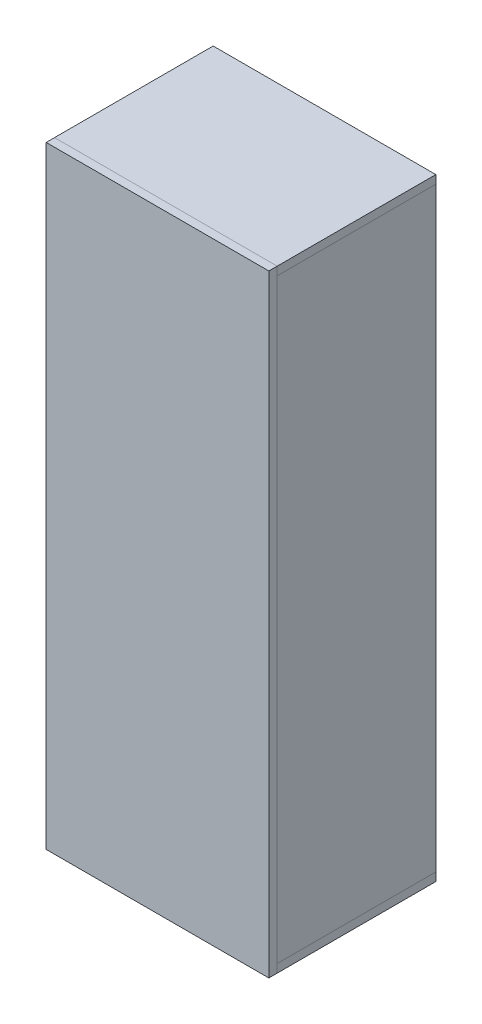
ISO-10303-21;
HEADER;
FILE_DESCRIPTION(('STEP AP214'),'2;1');
FILE_NAME('part.step','',(''),(''),'','','');
FILE_SCHEMA(('AUTOMOTIVE_DESIGN { 1 0 10303 214 1 1 1 1 }'));
ENDSEC;
DATA;
#1=APPLICATION_CONTEXT('core data for automotive mechanical design processes');
#2=APPLICATION_PROTOCOL_DEFINITION('international standard','automotive_design',2000,#1);
#3=PRODUCT_CONTEXT('',#1,'mechanical');
#4=PRODUCT('Part','Part','',(#3));
#5=PRODUCT_RELATED_PRODUCT_CATEGORY('part','',(#4));
#6=PRODUCT_DEFINITION_FORMATION('','',#4);
#7=PRODUCT_DEFINITION_CONTEXT('part definition',#1,'design');
#8=PRODUCT_DEFINITION('design','',#6,#7);
#9=PRODUCT_DEFINITION_SHAPE('','',#8);
#10=(LENGTH_UNIT() NAMED_UNIT(*) SI_UNIT(.MILLI.,.METRE.));
#11=(NAMED_UNIT(*) PLANE_ANGLE_UNIT() SI_UNIT($,.RADIAN.));
#12=(NAMED_UNIT(*) SI_UNIT($,.STERADIAN.) SOLID_ANGLE_UNIT());
#13=UNCERTAINTY_MEASURE_WITH_UNIT(LENGTH_MEASURE(1.E-05),#10,'distance_accuracy_value','');
#14=(GEOMETRIC_REPRESENTATION_CONTEXT(3) GLOBAL_UNCERTAINTY_ASSIGNED_CONTEXT((#13)) GLOBAL_UNIT_ASSIGNED_CONTEXT((#10,
#11,#12)) REPRESENTATION_CONTEXT('',''));
#15=CARTESIAN_POINT('',(0.,0.,0.));
#16=DIRECTION('',(0.,0.,1.));
#17=DIRECTION('',(1.,0.,0.));
#18=AXIS2_PLACEMENT_3D('',#15,#16,#17);
#19=CARTESIAN_POINT('',(0.,-7812.73256806932,0.));
#20=DIRECTION('',(0.,-1.,0.));
#21=DIRECTION('',(0.,0.,-1.));
#22=AXIS2_PLACEMENT_3D('',#19,#20,#21);
#23=PLANE('',#22);
#24=DIRECTION('',(0.,0.,-1.));
#25=VECTOR('',#24,1.);
#26=CARTESIAN_POINT('',(-788.349422114043,-7812.73256806932,-609.224669701424));
#27=LINE('',#26,#25);
#28=CARTESIAN_POINT('',(-788.349422114043,-7812.73256806932,-324.224669701424));
#29=VERTEX_POINT('',#28);
#30=CARTESIAN_POINT('',(-788.349422114043,-7812.73256806932,-609.224669701424));
#31=VERTEX_POINT('',#30);
#32=EDGE_CURVE('E100',#29,#31,#27,.T.);
#33=ORIENTED_EDGE('',*,*,#32,.T.);
#34=DIRECTION('',(-1.,0.,0.));
#35=VECTOR('',#34,1.);
#36=CARTESIAN_POINT('',(1.69093813868044E-13,-7812.73256806932,-609.224669701424));
#37=LINE('',#36,#35);
#38=CARTESIAN_POINT('',(-388.349422114043,-7812.73256806932,-609.224669701424));
#39=VERTEX_POINT('',#38);
#40=EDGE_CURVE('E13',#39,#31,#37,.T.);
#41=ORIENTED_EDGE('',*,*,#40,.F.);
#42=DIRECTION('',(0.,0.,1.));
#43=VECTOR('',#42,1.);
#44=CARTESIAN_POINT('',(-388.349422114043,-7812.73256806932,-609.224669701424));
#45=LINE('',#44,#43);
#46=CARTESIAN_POINT('',(-388.349422114043,-7812.73256806932,-324.224669701424));
#47=VERTEX_POINT('',#46);
#48=EDGE_CURVE('E61',#39,#47,#45,.T.);
#49=ORIENTED_EDGE('',*,*,#48,.T.);
#50=DIRECTION('',(1.,0.,0.));
#51=VECTOR('',#50,1.);
#52=CARTESIAN_POINT('',(0.,-7812.73256806932,-324.224669701424));
#53=LINE('',#52,#51);
#54=EDGE_CURVE('E97',#29,#47,#53,.T.);
#55=ORIENTED_EDGE('',*,*,#54,.F.);
#56=EDGE_LOOP('',(#33,#41,#49,#55));
#57=FACE_BOUND('',#56,.T.);
#58=ADVANCED_FACE('F57',(#57),#23,.T.);
#59=CARTESIAN_POINT('',(0.,0.,-324.224669701425));
#60=DIRECTION('',(0.,0.,-1.));
#61=DIRECTION('',(-1.,0.,0.));
#62=AXIS2_PLACEMENT_3D('',#59,#60,#61);
#63=PLANE('',#62);
#64=ORIENTED_EDGE('',*,*,#54,.T.);
#65=DIRECTION('',(0.,-1.,0.));
#66=VECTOR('',#65,1.);
#67=CARTESIAN_POINT('',(-388.349422114043,-7797.73256806932,-324.224669701424));
#68=LINE('',#67,#66);
#69=CARTESIAN_POINT('',(-388.349422114043,-7797.73256806932,-324.224669701424));
#70=VERTEX_POINT('',#69);
#71=EDGE_CURVE('E105',#70,#47,#68,.T.);
#72=ORIENTED_EDGE('',*,*,#71,.F.);
#73=DIRECTION('',(1.,0.,0.));
#74=VECTOR('',#73,1.);
#75=CARTESIAN_POINT('',(0.,-7797.73256806932,-324.224669701424));
#76=LINE('',#75,#74);
#77=CARTESIAN_POINT('',(-788.349422114043,-7797.73256806932,-324.224669701424));
#78=VERTEX_POINT('',#77);
#79=EDGE_CURVE('E109',#78,#70,#76,.T.);
#80=ORIENTED_EDGE('',*,*,#79,.F.);
#81=DIRECTION('',(0.,1.,0.));
#82=VECTOR('',#81,1.);
#83=CARTESIAN_POINT('',(-788.349422114043,-7797.73256806932,-324.224669701424));
#84=LINE('',#83,#82);
#85=EDGE_CURVE('E108',#29,#78,#84,.T.);
#86=ORIENTED_EDGE('',*,*,#85,.F.);
#87=EDGE_LOOP('',(#64,#72,#80,#86));
#88=FACE_BOUND('',#87,.T.);
#89=ADVANCED_FACE('F59',(#88),#63,.F.);
#90=CARTESIAN_POINT('',(-388.349422114043,-7797.73256806932,-609.224669701424));
#91=DIRECTION('',(-1.,0.,0.));
#92=DIRECTION('',(0.,0.,1.));
#93=AXIS2_PLACEMENT_3D('',#90,#91,#92);
#94=PLANE('',#93);
#95=ORIENTED_EDGE('',*,*,#48,.F.);
#96=DIRECTION('',(0.,-1.,0.));
#97=VECTOR('',#96,1.);
#98=CARTESIAN_POINT('',(-388.349422114043,-7797.73256806932,-609.224669701424));
#99=LINE('',#98,#97);
#100=CARTESIAN_POINT('',(-388.349422114043,-7797.73256806932,-609.224669701424));
#101=VERTEX_POINT('',#100);
#102=EDGE_CURVE('E119',#101,#39,#99,.T.);
#103=ORIENTED_EDGE('',*,*,#102,.F.);
#104=DIRECTION('',(0.,0.,-1.));
#105=VECTOR('',#104,1.);
#106=CARTESIAN_POINT('',(-388.349422114043,-7797.73256806932,-609.224669701424));
#107=LINE('',#106,#105);
#108=EDGE_CURVE('E66',#70,#101,#107,.T.);
#109=ORIENTED_EDGE('',*,*,#108,.F.);
#110=ORIENTED_EDGE('',*,*,#71,.T.);
#111=EDGE_LOOP('',(#95,#103,#109,#110));
#112=FACE_BOUND('',#111,.T.);
#113=ADVANCED_FACE('F122',(#112),#94,.F.);
#114=CARTESIAN_POINT('',(-388.349422114043,-7797.73256806932,-609.224669701424));
#115=DIRECTION('',(0.,0.,1.));
#116=DIRECTION('',(1.,0.,0.));
#117=AXIS2_PLACEMENT_3D('',#114,#115,#116);
#118=PLANE('',#117);
#119=ORIENTED_EDGE('',*,*,#40,.T.);
#120=DIRECTION('',(0.,-1.,0.));
#121=VECTOR('',#120,1.);
#122=CARTESIAN_POINT('',(-788.349422114043,-7797.73256806932,-609.224669701424));
#123=LINE('',#122,#121);
#124=CARTESIAN_POINT('',(-788.349422114043,-7797.73256806932,-609.224669701424));
#125=VERTEX_POINT('',#124);
#126=EDGE_CURVE('E115',#125,#31,#123,.T.);
#127=ORIENTED_EDGE('',*,*,#126,.F.);
#128=DIRECTION('',(-1.,0.,0.));
#129=VECTOR('',#128,1.);
#130=CARTESIAN_POINT('',(-388.349422114043,-7797.73256806932,-609.224669701424));
#131=LINE('',#130,#129);
#132=EDGE_CURVE('E77',#101,#125,#131,.T.);
#133=ORIENTED_EDGE('',*,*,#132,.F.);
#134=ORIENTED_EDGE('',*,*,#102,.T.);
#135=EDGE_LOOP('',(#119,#127,#133,#134));
#136=FACE_BOUND('',#135,.T.);
#137=ADVANCED_FACE('F135',(#136),#118,.F.);
#138=CARTESIAN_POINT('',(-788.349422114043,-7797.73256806932,-609.224669701424));
#139=DIRECTION('',(1.,0.,0.));
#140=DIRECTION('',(0.,0.,-1.));
#141=AXIS2_PLACEMENT_3D('',#138,#139,#140);
#142=PLANE('',#141);
#143=ORIENTED_EDGE('',*,*,#32,.F.);
#144=ORIENTED_EDGE('',*,*,#85,.T.);
#145=DIRECTION('',(0.,0.,1.));
#146=VECTOR('',#145,1.);
#147=CARTESIAN_POINT('',(-788.349422114043,-7797.73256806932,-609.224669701424));
#148=LINE('',#147,#146);
#149=EDGE_CURVE('E125',#125,#78,#148,.T.);
#150=ORIENTED_EDGE('',*,*,#149,.F.);
#151=ORIENTED_EDGE('',*,*,#126,.T.);
#152=EDGE_LOOP('',(#143,#144,#150,#151));
#153=FACE_BOUND('',#152,.T.);
#154=ADVANCED_FACE('F114',(#153),#142,.F.);
#155=CARTESIAN_POINT('',(0.,-7797.73256806932,-1.47021566313835E-13));
#156=DIRECTION('',(0.,-1.,0.));
#157=DIRECTION('',(0.,0.,-1.));
#158=AXIS2_PLACEMENT_3D('',#155,#156,#157);
#159=PLANE('',#158);
#160=ORIENTED_EDGE('',*,*,#149,.T.);
#161=ORIENTED_EDGE('',*,*,#79,.T.);
#162=ORIENTED_EDGE('',*,*,#108,.T.);
#163=ORIENTED_EDGE('',*,*,#132,.T.);
#164=EDGE_LOOP('',(#160,#161,#162,#163));
#165=FACE_BOUND('',#164,.T.);
#166=ADVANCED_FACE('F129',(#165),#159,.F.);
#167=CLOSED_SHELL('',(#58,#89,#113,#137,#154,#166));
#168=MANIFOLD_SOLID_BREP('B2',#167);
#169=CARTESIAN_POINT('',(0.,-7812.73256806932,0.));
#170=DIRECTION('',(0.,-1.,0.));
#171=DIRECTION('',(0.,0.,-1.));
#172=AXIS2_PLACEMENT_3D('',#169,#170,#171);
#173=PLANE('',#172);
#174=DIRECTION('',(0.,0.,1.));
#175=VECTOR('',#174,1.);
#176=CARTESIAN_POINT('',(-388.349422114043,-7812.73256806932,-609.224669701424));
#177=LINE('',#176,#175);
#178=CARTESIAN_POINT('',(-388.349422114043,-7812.73256806932,-609.224669701424));
#179=VERTEX_POINT('',#178);
#180=CARTESIAN_POINT('',(-388.349422114043,-7812.73256806932,-324.224669701424));
#181=VERTEX_POINT('',#180);
#182=EDGE_CURVE('E270',#179,#181,#177,.T.);
#183=ORIENTED_EDGE('',*,*,#182,.F.);
#184=DIRECTION('',(1.,0.,0.));
#185=VECTOR('',#184,1.);
#186=CARTESIAN_POINT('',(-388.349422114043,-7812.73256806932,-609.224669701424));
#187=LINE('',#186,#185);
#188=CARTESIAN_POINT('',(-403.349422114043,-7812.73256806932,-609.224669701424));
#189=VERTEX_POINT('',#188);
#190=EDGE_CURVE('E210',#189,#179,#187,.T.);
#191=ORIENTED_EDGE('',*,*,#190,.F.);
#192=DIRECTION('',(0.,0.,-1.));
#193=VECTOR('',#192,1.);
#194=CARTESIAN_POINT('',(-403.349422114043,-7812.73256806932,0.));
#195=LINE('',#194,#193);
#196=CARTESIAN_POINT('',(-403.349422114043,-7812.73256806932,-324.224669701424));
#197=VERTEX_POINT('',#196);
#198=EDGE_CURVE('E55',#197,#189,#195,.T.);
#199=ORIENTED_EDGE('',*,*,#198,.F.);
#200=DIRECTION('',(-1.,0.,0.));
#201=VECTOR('',#200,1.);
#202=CARTESIAN_POINT('',(0.,-7812.73256806932,-324.224669701424));
#203=LINE('',#202,#201);
#204=EDGE_CURVE('E229',#181,#197,#203,.T.);
#205=ORIENTED_EDGE('',*,*,#204,.F.);
#206=EDGE_LOOP('',(#183,#191,#199,#205));
#207=FACE_BOUND('',#206,.T.);
#208=ADVANCED_FACE('F207',(#207),#173,.F.);
#209=CARTESIAN_POINT('',(0.,-8882.73256806932,0.));
#210=DIRECTION('',(0.,1.,0.));
#211=DIRECTION('',(0.,0.,1.));
#212=AXIS2_PLACEMENT_3D('',#209,#210,#211);
#213=PLANE('',#212);
#214=DIRECTION('',(0.,0.,-1.));
#215=VECTOR('',#214,1.);
#216=CARTESIAN_POINT('',(-388.349422114043,-8882.73256806932,-609.224669701424));
#217=LINE('',#216,#215);
#218=CARTESIAN_POINT('',(-388.349422114043,-8882.73256806932,-324.224669701424));
#219=VERTEX_POINT('',#218);
#220=CARTESIAN_POINT('',(-388.349422114043,-8882.73256806932,-609.224669701424));
#221=VERTEX_POINT('',#220);
#222=EDGE_CURVE('E272',#219,#221,#217,.T.);
#223=ORIENTED_EDGE('',*,*,#222,.F.);
#224=DIRECTION('',(1.,0.,0.));
#225=VECTOR('',#224,1.);
#226=CARTESIAN_POINT('',(0.,-8882.73256806932,-324.224669701424));
#227=LINE('',#226,#225);
#228=CARTESIAN_POINT('',(-403.349422114043,-8882.73256806932,-324.224669701424));
#229=VERTEX_POINT('',#228);
#230=EDGE_CURVE('E262',#229,#219,#227,.T.);
#231=ORIENTED_EDGE('',*,*,#230,.F.);
#232=DIRECTION('',(0.,0.,-1.));
#233=VECTOR('',#232,1.);
#234=CARTESIAN_POINT('',(-403.349422114043,-8882.73256806932,1.49269271800087E-13));
#235=LINE('',#234,#233);
#236=CARTESIAN_POINT('',(-403.349422114043,-8882.73256806932,-609.224669701424));
#237=VERTEX_POINT('',#236);
#238=EDGE_CURVE('E260',#229,#237,#235,.T.);
#239=ORIENTED_EDGE('',*,*,#238,.T.);
#240=DIRECTION('',(-1.,0.,0.));
#241=VECTOR('',#240,1.);
#242=CARTESIAN_POINT('',(-388.349422114043,-8882.73256806932,-609.224669701424));
#243=LINE('',#242,#241);
#244=EDGE_CURVE('E249',#221,#237,#243,.T.);
#245=ORIENTED_EDGE('',*,*,#244,.F.);
#246=EDGE_LOOP('',(#223,#231,#239,#245));
#247=FACE_BOUND('',#246,.T.);
#248=ADVANCED_FACE('F261',(#247),#213,.F.);
#249=CARTESIAN_POINT('',(-388.349422114043,-7797.73256806932,-609.224669701424));
#250=DIRECTION('',(-1.,0.,0.));
#251=DIRECTION('',(0.,0.,1.));
#252=AXIS2_PLACEMENT_3D('',#249,#250,#251);
#253=PLANE('',#252);
#254=DIRECTION('',(0.,-1.,0.));
#255=VECTOR('',#254,1.);
#256=CARTESIAN_POINT('',(-388.349422114043,-7797.73256806932,-609.224669701424));
#257=LINE('',#256,#255);
#258=EDGE_CURVE('E253',#179,#221,#257,.T.);
#259=ORIENTED_EDGE('',*,*,#258,.F.);
#260=ORIENTED_EDGE('',*,*,#182,.T.);
#261=DIRECTION('',(0.,-1.,0.));
#262=VECTOR('',#261,1.);
#263=CARTESIAN_POINT('',(-388.349422114043,-7797.73256806932,-324.224669701424));
#264=LINE('',#263,#262);
#265=EDGE_CURVE('E266',#181,#219,#264,.T.);
#266=ORIENTED_EDGE('',*,*,#265,.T.);
#267=ORIENTED_EDGE('',*,*,#222,.T.);
#268=EDGE_LOOP('',(#259,#260,#266,#267));
#269=FACE_BOUND('',#268,.T.);
#270=ADVANCED_FACE('F278',(#269),#253,.F.);
#271=CARTESIAN_POINT('',(-388.349422114043,-7797.73256806932,-609.224669701424));
#272=DIRECTION('',(0.,0.,1.));
#273=DIRECTION('',(1.,0.,0.));
#274=AXIS2_PLACEMENT_3D('',#271,#272,#273);
#275=PLANE('',#274);
#276=DIRECTION('',(0.,-1.,0.));
#277=VECTOR('',#276,1.);
#278=CARTESIAN_POINT('',(-403.349422114043,-7797.73256806932,-609.224669701424));
#279=LINE('',#278,#277);
#280=EDGE_CURVE('E215',#189,#237,#279,.T.);
#281=ORIENTED_EDGE('',*,*,#280,.F.);
#282=ORIENTED_EDGE('',*,*,#190,.T.);
#283=ORIENTED_EDGE('',*,*,#258,.T.);
#284=ORIENTED_EDGE('',*,*,#244,.T.);
#285=EDGE_LOOP('',(#281,#282,#283,#284));
#286=FACE_BOUND('',#285,.T.);
#287=ADVANCED_FACE('F251',(#286),#275,.F.);
#288=CARTESIAN_POINT('',(0.,0.,-324.224669701425));
#289=DIRECTION('',(0.,0.,-1.));
#290=DIRECTION('',(-1.,0.,0.));
#291=AXIS2_PLACEMENT_3D('',#288,#289,#290);
#292=PLANE('',#291);
#293=ORIENTED_EDGE('',*,*,#265,.F.);
#294=ORIENTED_EDGE('',*,*,#204,.T.);
#295=DIRECTION('',(0.,-1.,0.));
#296=VECTOR('',#295,1.);
#297=CARTESIAN_POINT('',(-403.349422114043,-7797.73256806932,-324.224669701424));
#298=LINE('',#297,#296);
#299=EDGE_CURVE('E257',#197,#229,#298,.T.);
#300=ORIENTED_EDGE('',*,*,#299,.T.);
#301=ORIENTED_EDGE('',*,*,#230,.T.);
#302=EDGE_LOOP('',(#293,#294,#300,#301));
#303=FACE_BOUND('',#302,.T.);
#304=ADVANCED_FACE('F280',(#303),#292,.F.);
#305=CARTESIAN_POINT('',(-403.349422114043,-7797.73256806932,-609.224669701424));
#306=DIRECTION('',(-1.,0.,0.));
#307=DIRECTION('',(0.,0.,1.));
#308=AXIS2_PLACEMENT_3D('',#305,#306,#307);
#309=PLANE('',#308);
#310=ORIENTED_EDGE('',*,*,#238,.F.);
#311=ORIENTED_EDGE('',*,*,#299,.F.);
#312=ORIENTED_EDGE('',*,*,#198,.T.);
#313=ORIENTED_EDGE('',*,*,#280,.T.);
#314=EDGE_LOOP('',(#310,#311,#312,#313));
#315=FACE_BOUND('',#314,.T.);
#316=ADVANCED_FACE('F264',(#315),#309,.T.);
#317=CLOSED_SHELL('',(#208,#248,#270,#287,#304,#316));
#318=MANIFOLD_SOLID_BREP('B7',#317);
#319=CARTESIAN_POINT('',(0.,-7812.73256806932,0.));
#320=DIRECTION('',(0.,-1.,0.));
#321=DIRECTION('',(0.,0.,-1.));
#322=AXIS2_PLACEMENT_3D('',#319,#320,#321);
#323=PLANE('',#322);
#324=DIRECTION('',(0.,0.,-1.));
#325=VECTOR('',#324,1.);
#326=CARTESIAN_POINT('',(-788.349422114043,-7812.73256806932,-609.224669701424));
#327=LINE('',#326,#325);
#328=CARTESIAN_POINT('',(-788.349422114043,-7812.73256806932,-324.224669701424));
#329=VERTEX_POINT('',#328);
#330=CARTESIAN_POINT('',(-788.349422114043,-7812.73256806932,-609.224669701424));
#331=VERTEX_POINT('',#330);
#332=EDGE_CURVE('E401',#329,#331,#327,.T.);
#333=ORIENTED_EDGE('',*,*,#332,.F.);
#334=DIRECTION('',(-1.,0.,0.));
#335=VECTOR('',#334,1.);
#336=CARTESIAN_POINT('',(0.,-7812.73256806932,-324.224669701424));
#337=LINE('',#336,#335);
#338=CARTESIAN_POINT('',(-773.349422114043,-7812.73256806932,-324.224669701424));
#339=VERTEX_POINT('',#338);
#340=EDGE_CURVE('E351',#339,#329,#337,.T.);
#341=ORIENTED_EDGE('',*,*,#340,.F.);
#342=DIRECTION('',(0.,0.,1.));
#343=VECTOR('',#342,1.);
#344=CARTESIAN_POINT('',(-773.349422114043,-7812.73256806932,-1.47021566313835E-13));
#345=LINE('',#344,#343);
#346=CARTESIAN_POINT('',(-773.349422114043,-7812.73256806932,-609.224669701424));
#347=VERTEX_POINT('',#346);
#348=EDGE_CURVE('E205',#347,#339,#345,.T.);
#349=ORIENTED_EDGE('',*,*,#348,.F.);
#350=DIRECTION('',(1.,0.,0.));
#351=VECTOR('',#350,1.);
#352=CARTESIAN_POINT('',(-388.349422114043,-7812.73256806932,-609.224669701424));
#353=LINE('',#352,#351);
#354=EDGE_CURVE('E364',#331,#347,#353,.T.);
#355=ORIENTED_EDGE('',*,*,#354,.F.);
#356=EDGE_LOOP('',(#333,#341,#349,#355));
#357=FACE_BOUND('',#356,.T.);
#358=ADVANCED_FACE('F347',(#357),#323,.F.);
#359=CARTESIAN_POINT('',(0.,-8882.73256806932,0.));
#360=DIRECTION('',(0.,1.,0.));
#361=DIRECTION('',(0.,0.,1.));
#362=AXIS2_PLACEMENT_3D('',#359,#360,#361);
#363=PLANE('',#362);
#364=DIRECTION('',(0.,0.,1.));
#365=VECTOR('',#364,1.);
#366=CARTESIAN_POINT('',(-788.349422114043,-8882.73256806932,-609.224669701424));
#367=LINE('',#366,#365);
#368=CARTESIAN_POINT('',(-788.349422114043,-8882.73256806932,-609.224669701424));
#369=VERTEX_POINT('',#368);
#370=CARTESIAN_POINT('',(-788.349422114043,-8882.73256806932,-324.224669701424));
#371=VERTEX_POINT('',#370);
#372=EDGE_CURVE('E399',#369,#371,#367,.T.);
#373=ORIENTED_EDGE('',*,*,#372,.F.);
#374=DIRECTION('',(-1.,0.,0.));
#375=VECTOR('',#374,1.);
#376=CARTESIAN_POINT('',(-388.349422114043,-8882.73256806932,-609.224669701424));
#377=LINE('',#376,#375);
#378=CARTESIAN_POINT('',(-773.349422114043,-8882.73256806932,-609.224669701424));
#379=VERTEX_POINT('',#378);
#380=EDGE_CURVE('E396',#379,#369,#377,.T.);
#381=ORIENTED_EDGE('',*,*,#380,.F.);
#382=DIRECTION('',(0.,0.,1.));
#383=VECTOR('',#382,1.);
#384=CARTESIAN_POINT('',(-773.349422114043,-8882.73256806932,0.));
#385=LINE('',#384,#383);
#386=CARTESIAN_POINT('',(-773.349422114043,-8882.73256806932,-324.224669701424));
#387=VERTEX_POINT('',#386);
#388=EDGE_CURVE('E388',#379,#387,#385,.T.);
#389=ORIENTED_EDGE('',*,*,#388,.T.);
#390=DIRECTION('',(1.,0.,0.));
#391=VECTOR('',#390,1.);
#392=CARTESIAN_POINT('',(0.,-8882.73256806932,-324.224669701424));
#393=LINE('',#392,#391);
#394=EDGE_CURVE('E411',#371,#387,#393,.T.);
#395=ORIENTED_EDGE('',*,*,#394,.F.);
#396=EDGE_LOOP('',(#373,#381,#389,#395));
#397=FACE_BOUND('',#396,.T.);
#398=ADVANCED_FACE('F397',(#397),#363,.F.);
#399=CARTESIAN_POINT('',(0.,0.,-324.224669701425));
#400=DIRECTION('',(0.,0.,-1.));
#401=DIRECTION('',(-1.,0.,0.));
#402=AXIS2_PLACEMENT_3D('',#399,#400,#401);
#403=PLANE('',#402);
#404=DIRECTION('',(0.,-1.,0.));
#405=VECTOR('',#404,1.);
#406=CARTESIAN_POINT('',(-773.349422114043,-7797.73256806932,-324.224669701424));
#407=LINE('',#406,#405);
#408=EDGE_CURVE('E356',#339,#387,#407,.T.);
#409=ORIENTED_EDGE('',*,*,#408,.F.);
#410=ORIENTED_EDGE('',*,*,#340,.T.);
#411=DIRECTION('',(0.,1.,0.));
#412=VECTOR('',#411,1.);
#413=CARTESIAN_POINT('',(-788.349422114043,-7797.73256806932,-324.224669701424));
#414=LINE('',#413,#412);
#415=EDGE_CURVE('E405',#371,#329,#414,.T.);
#416=ORIENTED_EDGE('',*,*,#415,.F.);
#417=ORIENTED_EDGE('',*,*,#394,.T.);
#418=EDGE_LOOP('',(#409,#410,#416,#417));
#419=FACE_BOUND('',#418,.T.);
#420=ADVANCED_FACE('F420',(#419),#403,.F.);
#421=CARTESIAN_POINT('',(-388.349422114043,-7797.73256806932,-609.224669701424));
#422=DIRECTION('',(0.,0.,1.));
#423=DIRECTION('',(1.,0.,0.));
#424=AXIS2_PLACEMENT_3D('',#421,#422,#423);
#425=PLANE('',#424);
#426=DIRECTION('',(0.,-1.,0.));
#427=VECTOR('',#426,1.);
#428=CARTESIAN_POINT('',(-788.349422114043,-7797.73256806932,-609.224669701424));
#429=LINE('',#428,#427);
#430=EDGE_CURVE('E402',#331,#369,#429,.T.);
#431=ORIENTED_EDGE('',*,*,#430,.F.);
#432=ORIENTED_EDGE('',*,*,#354,.T.);
#433=DIRECTION('',(0.,-1.,0.));
#434=VECTOR('',#433,1.);
#435=CARTESIAN_POINT('',(-773.349422114043,-7797.73256806932,-609.224669701424));
#436=LINE('',#435,#434);
#437=EDGE_CURVE('E391',#347,#379,#436,.T.);
#438=ORIENTED_EDGE('',*,*,#437,.T.);
#439=ORIENTED_EDGE('',*,*,#380,.T.);
#440=EDGE_LOOP('',(#431,#432,#438,#439));
#441=FACE_BOUND('',#440,.T.);
#442=ADVANCED_FACE('F349',(#441),#425,.F.);
#443=CARTESIAN_POINT('',(-773.349422114043,-7797.73256806932,-609.224669701424));
#444=DIRECTION('',(1.,0.,0.));
#445=DIRECTION('',(0.,0.,-1.));
#446=AXIS2_PLACEMENT_3D('',#443,#444,#445);
#447=PLANE('',#446);
#448=ORIENTED_EDGE('',*,*,#388,.F.);
#449=ORIENTED_EDGE('',*,*,#437,.F.);
#450=ORIENTED_EDGE('',*,*,#348,.T.);
#451=ORIENTED_EDGE('',*,*,#408,.T.);
#452=EDGE_LOOP('',(#448,#449,#450,#451));
#453=FACE_BOUND('',#452,.T.);
#454=ADVANCED_FACE('F390',(#453),#447,.T.);
#455=CARTESIAN_POINT('',(-788.349422114043,-7797.73256806932,-609.224669701424));
#456=DIRECTION('',(1.,0.,0.));
#457=DIRECTION('',(0.,0.,-1.));
#458=AXIS2_PLACEMENT_3D('',#455,#456,#457);
#459=PLANE('',#458);
#460=ORIENTED_EDGE('',*,*,#415,.T.);
#461=ORIENTED_EDGE('',*,*,#332,.T.);
#462=ORIENTED_EDGE('',*,*,#430,.T.);
#463=ORIENTED_EDGE('',*,*,#372,.T.);
#464=EDGE_LOOP('',(#460,#461,#462,#463));
#465=FACE_BOUND('',#464,.T.);
#466=ADVANCED_FACE('F417',(#465),#459,.F.);
#467=CLOSED_SHELL('',(#358,#398,#420,#442,#454,#466));
#468=MANIFOLD_SOLID_BREP('B49',#467);
#469=CARTESIAN_POINT('',(0.,-8882.73256806932,0.));
#470=DIRECTION('',(0.,-1.,0.));
#471=DIRECTION('',(0.,0.,-1.));
#472=AXIS2_PLACEMENT_3D('',#469,#470,#471);
#473=PLANE('',#472);
#474=DIRECTION('',(1.,0.,0.));
#475=VECTOR('',#474,1.);
#476=CARTESIAN_POINT('',(0.,-8882.73256806932,-324.224669701424));
#477=LINE('',#476,#475);
#478=CARTESIAN_POINT('',(-788.349422114043,-8882.73256806932,-324.224669701424));
#479=VERTEX_POINT('',#478);
#480=CARTESIAN_POINT('',(-388.349422114043,-8882.73256806932,-324.224669701424));
#481=VERTEX_POINT('',#480);
#482=EDGE_CURVE('E501',#479,#481,#477,.T.);
#483=ORIENTED_EDGE('',*,*,#482,.T.);
#484=DIRECTION('',(0.,0.,-1.));
#485=VECTOR('',#484,1.);
#486=CARTESIAN_POINT('',(-388.349422114043,-8882.73256806932,-609.224669701424));
#487=LINE('',#486,#485);
#488=CARTESIAN_POINT('',(-388.349422114043,-8882.73256806932,-609.224669701424));
#489=VERTEX_POINT('',#488);
#490=EDGE_CURVE('E490',#481,#489,#487,.T.);
#491=ORIENTED_EDGE('',*,*,#490,.T.);
#492=DIRECTION('',(-1.,0.,0.));
#493=VECTOR('',#492,1.);
#494=CARTESIAN_POINT('',(1.69093813868044E-13,-8882.73256806932,-609.224669701424));
#495=LINE('',#494,#493);
#496=CARTESIAN_POINT('',(-788.349422114043,-8882.73256806932,-609.224669701424));
#497=VERTEX_POINT('',#496);
#498=EDGE_CURVE('E508',#489,#497,#495,.T.);
#499=ORIENTED_EDGE('',*,*,#498,.T.);
#500=DIRECTION('',(0.,0.,1.));
#501=VECTOR('',#500,1.);
#502=CARTESIAN_POINT('',(-788.349422114043,-8882.73256806932,-609.224669701424));
#503=LINE('',#502,#501);
#504=EDGE_CURVE('E345',#497,#479,#503,.T.);
#505=ORIENTED_EDGE('',*,*,#504,.T.);
#506=EDGE_LOOP('',(#483,#491,#499,#505));
#507=FACE_BOUND('',#506,.T.);
#508=ADVANCED_FACE('F486',(#507),#473,.F.);
#509=CARTESIAN_POINT('',(-388.349422114043,-7797.73256806932,-609.224669701424));
#510=DIRECTION('',(-1.,0.,0.));
#511=DIRECTION('',(0.,0.,1.));
#512=AXIS2_PLACEMENT_3D('',#509,#510,#511);
#513=PLANE('',#512);
#514=ORIENTED_EDGE('',*,*,#490,.F.);
#515=DIRECTION('',(0.,-1.,0.));
#516=VECTOR('',#515,1.);
#517=CARTESIAN_POINT('',(-388.349422114043,-7797.73256806932,-324.224669701424));
#518=LINE('',#517,#516);
#519=CARTESIAN_POINT('',(-388.349422114043,-8897.73256806932,-324.224669701424));
#520=VERTEX_POINT('',#519);
#521=EDGE_CURVE('E542',#481,#520,#518,.T.);
#522=ORIENTED_EDGE('',*,*,#521,.T.);
#523=DIRECTION('',(0.,0.,-1.));
#524=VECTOR('',#523,1.);
#525=CARTESIAN_POINT('',(-388.349422114043,-8897.73256806932,-609.224669701424));
#526=LINE('',#525,#524);
#527=CARTESIAN_POINT('',(-388.349422114043,-8897.73256806932,-609.224669701424));
#528=VERTEX_POINT('',#527);
#529=EDGE_CURVE('E540',#520,#528,#526,.T.);
#530=ORIENTED_EDGE('',*,*,#529,.T.);
#531=DIRECTION('',(0.,-1.,0.));
#532=VECTOR('',#531,1.);
#533=CARTESIAN_POINT('',(-388.349422114043,-7797.73256806932,-609.224669701424));
#534=LINE('',#533,#532);
#535=EDGE_CURVE('E528',#489,#528,#534,.T.);
#536=ORIENTED_EDGE('',*,*,#535,.F.);
#537=EDGE_LOOP('',(#514,#522,#530,#536));
#538=FACE_BOUND('',#537,.T.);
#539=ADVANCED_FACE('F541',(#538),#513,.F.);
#540=CARTESIAN_POINT('',(0.,-8897.73256806932,0.));
#541=DIRECTION('',(0.,-1.,0.));
#542=DIRECTION('',(0.,0.,-1.));
#543=AXIS2_PLACEMENT_3D('',#540,#541,#542);
#544=PLANE('',#543);
#545=DIRECTION('',(1.,0.,0.));
#546=VECTOR('',#545,1.);
#547=CARTESIAN_POINT('',(0.,-8897.73256806932,-324.224669701424));
#548=LINE('',#547,#546);
#549=CARTESIAN_POINT('',(-788.349422114043,-8897.73256806932,-324.224669701424));
#550=VERTEX_POINT('',#549);
#551=EDGE_CURVE('E554',#550,#520,#548,.T.);
#552=ORIENTED_EDGE('',*,*,#551,.F.);
#553=DIRECTION('',(0.,0.,1.));
#554=VECTOR('',#553,1.);
#555=CARTESIAN_POINT('',(-788.349422114043,-8897.73256806932,-609.224669701424));
#556=LINE('',#555,#554);
#557=CARTESIAN_POINT('',(-788.349422114043,-8897.73256806932,-609.224669701424));
#558=VERTEX_POINT('',#557);
#559=EDGE_CURVE('E548',#558,#550,#556,.T.);
#560=ORIENTED_EDGE('',*,*,#559,.F.);
#561=DIRECTION('',(-1.,0.,0.));
#562=VECTOR('',#561,1.);
#563=CARTESIAN_POINT('',(-388.349422114043,-8897.73256806932,-609.224669701424));
#564=LINE('',#563,#562);
#565=EDGE_CURVE('E532',#528,#558,#564,.T.);
#566=ORIENTED_EDGE('',*,*,#565,.F.);
#567=ORIENTED_EDGE('',*,*,#529,.F.);
#568=EDGE_LOOP('',(#552,#560,#566,#567));
#569=FACE_BOUND('',#568,.T.);
#570=ADVANCED_FACE('F546',(#569),#544,.T.);
#571=CARTESIAN_POINT('',(-788.349422114043,-7797.73256806932,-609.224669701424));
#572=DIRECTION('',(1.,0.,0.));
#573=DIRECTION('',(0.,0.,-1.));
#574=AXIS2_PLACEMENT_3D('',#571,#572,#573);
#575=PLANE('',#574);
#576=ORIENTED_EDGE('',*,*,#504,.F.);
#577=DIRECTION('',(0.,-1.,0.));
#578=VECTOR('',#577,1.);
#579=CARTESIAN_POINT('',(-788.349422114043,-7797.73256806932,-609.224669701424));
#580=LINE('',#579,#578);
#581=EDGE_CURVE('E537',#497,#558,#580,.T.);
#582=ORIENTED_EDGE('',*,*,#581,.T.);
#583=ORIENTED_EDGE('',*,*,#559,.T.);
#584=DIRECTION('',(0.,1.,0.));
#585=VECTOR('',#584,1.);
#586=CARTESIAN_POINT('',(-788.349422114043,-7797.73256806932,-324.224669701424));
#587=LINE('',#586,#585);
#588=EDGE_CURVE('E536',#550,#479,#587,.T.);
#589=ORIENTED_EDGE('',*,*,#588,.T.);
#590=EDGE_LOOP('',(#576,#582,#583,#589));
#591=FACE_BOUND('',#590,.T.);
#592=ADVANCED_FACE('F559',(#591),#575,.F.);
#593=CARTESIAN_POINT('',(0.,0.,-324.224669701425));
#594=DIRECTION('',(0.,0.,-1.));
#595=DIRECTION('',(-1.,0.,0.));
#596=AXIS2_PLACEMENT_3D('',#593,#594,#595);
#597=PLANE('',#596);
#598=ORIENTED_EDGE('',*,*,#482,.F.);
#599=ORIENTED_EDGE('',*,*,#588,.F.);
#600=ORIENTED_EDGE('',*,*,#551,.T.);
#601=ORIENTED_EDGE('',*,*,#521,.F.);
#602=EDGE_LOOP('',(#598,#599,#600,#601));
#603=FACE_BOUND('',#602,.T.);
#604=ADVANCED_FACE('F488',(#603),#597,.F.);
#605=CARTESIAN_POINT('',(-388.349422114043,-7797.73256806932,-609.224669701424));
#606=DIRECTION('',(0.,0.,1.));
#607=DIRECTION('',(1.,0.,0.));
#608=AXIS2_PLACEMENT_3D('',#605,#606,#607);
#609=PLANE('',#608);
#610=ORIENTED_EDGE('',*,*,#498,.F.);
#611=ORIENTED_EDGE('',*,*,#535,.T.);
#612=ORIENTED_EDGE('',*,*,#565,.T.);
#613=ORIENTED_EDGE('',*,*,#581,.F.);
#614=EDGE_LOOP('',(#610,#611,#612,#613));
#615=FACE_BOUND('',#614,.T.);
#616=ADVANCED_FACE('F530',(#615),#609,.F.);
#617=CLOSED_SHELL('',(#508,#539,#570,#592,#604,#616));
#618=MANIFOLD_SOLID_BREP('B199',#617);
#619=CARTESIAN_POINT('',(0.,0.,-324.224669701425));
#620=DIRECTION('',(0.,0.,-1.));
#621=DIRECTION('',(-1.,0.,0.));
#622=AXIS2_PLACEMENT_3D('',#619,#620,#621);
#623=PLANE('',#622);
#624=DIRECTION('',(0.,1.,0.));
#625=VECTOR('',#624,1.);
#626=CARTESIAN_POINT('',(-788.349422114043,-7797.73256806932,-324.224669701424));
#627=LINE('',#626,#625);
#628=CARTESIAN_POINT('',(-788.349422114043,-8897.73256806932,-324.224669701424));
#629=VERTEX_POINT('',#628);
#630=CARTESIAN_POINT('',(-788.349422114043,-7797.73256806932,-324.224669701424));
#631=VERTEX_POINT('',#630);
#632=EDGE_CURVE('E683',#629,#631,#627,.T.);
#633=ORIENTED_EDGE('',*,*,#632,.T.);
#634=DIRECTION('',(1.,0.,0.));
#635=VECTOR('',#634,1.);
#636=CARTESIAN_POINT('',(0.,-7797.73256806932,-324.224669701424));
#637=LINE('',#636,#635);
#638=CARTESIAN_POINT('',(-388.349422114043,-7797.73256806932,-324.224669701424));
#639=VERTEX_POINT('',#638);
#640=EDGE_CURVE('E674',#631,#639,#637,.T.);
#641=ORIENTED_EDGE('',*,*,#640,.T.);
#642=DIRECTION('',(0.,-1.,0.));
#643=VECTOR('',#642,1.);
#644=CARTESIAN_POINT('',(-388.349422114043,-7797.73256806932,-324.224669701424));
#645=LINE('',#644,#643);
#646=CARTESIAN_POINT('',(-388.349422114043,-8897.73256806932,-324.224669701424));
#647=VERTEX_POINT('',#646);
#648=EDGE_CURVE('E680',#639,#647,#645,.T.);
#649=ORIENTED_EDGE('',*,*,#648,.T.);
#650=DIRECTION('',(1.,0.,0.));
#651=VECTOR('',#650,1.);
#652=CARTESIAN_POINT('',(0.,-8897.73256806932,-324.224669701424));
#653=LINE('',#652,#651);
#654=EDGE_CURVE('E661',#629,#647,#653,.T.);
#655=ORIENTED_EDGE('',*,*,#654,.F.);
#656=EDGE_LOOP('',(#633,#641,#649,#655));
#657=FACE_BOUND('',#656,.T.);
#658=ADVANCED_FACE('F626',(#657),#623,.T.);
#659=CARTESIAN_POINT('',(-388.349422114043,-7797.73256806932,-309.224669701424));
#660=DIRECTION('',(0.,0.,-1.));
#661=DIRECTION('',(-1.,0.,0.));
#662=AXIS2_PLACEMENT_3D('',#659,#660,#661);
#663=PLANE('',#662);
#664=DIRECTION('',(1.,0.,0.));
#665=VECTOR('',#664,1.);
#666=CARTESIAN_POINT('',(-388.349422114043,-8897.73256806932,-309.224669701424));
#667=LINE('',#666,#665);
#668=CARTESIAN_POINT('',(-788.349422114043,-8897.73256806932,-309.224669701424));
#669=VERTEX_POINT('',#668);
#670=CARTESIAN_POINT('',(-388.349422114043,-8897.73256806932,-309.224669701424));
#671=VERTEX_POINT('',#670);
#672=EDGE_CURVE('E677',#669,#671,#667,.T.);
#673=ORIENTED_EDGE('',*,*,#672,.T.);
#674=DIRECTION('',(0.,-1.,0.));
#675=VECTOR('',#674,1.);
#676=CARTESIAN_POINT('',(-388.349422114043,-7797.73256806932,-309.224669701424));
#677=LINE('',#676,#675);
#678=CARTESIAN_POINT('',(-388.349422114043,-7797.73256806932,-309.224669701424));
#679=VERTEX_POINT('',#678);
#680=EDGE_CURVE('E694',#679,#671,#677,.T.);
#681=ORIENTED_EDGE('',*,*,#680,.F.);
#682=DIRECTION('',(1.,0.,0.));
#683=VECTOR('',#682,1.);
#684=CARTESIAN_POINT('',(-388.349422114043,-7797.73256806932,-309.224669701424));
#685=LINE('',#684,#683);
#686=CARTESIAN_POINT('',(-788.349422114043,-7797.73256806932,-309.224669701424));
#687=VERTEX_POINT('',#686);
#688=EDGE_CURVE('E654',#687,#679,#685,.T.);
#689=ORIENTED_EDGE('',*,*,#688,.F.);
#690=DIRECTION('',(0.,-1.,0.));
#691=VECTOR('',#690,1.);
#692=CARTESIAN_POINT('',(-788.349422114043,-7797.73256806932,-309.224669701424));
#693=LINE('',#692,#691);
#694=EDGE_CURVE('E697',#687,#669,#693,.T.);
#695=ORIENTED_EDGE('',*,*,#694,.T.);
#696=EDGE_LOOP('',(#673,#681,#689,#695));
#697=FACE_BOUND('',#696,.T.);
#698=ADVANCED_FACE('F706',(#697),#663,.F.);
#699=CARTESIAN_POINT('',(-388.349422114043,-7797.73256806932,-609.224669701424));
#700=DIRECTION('',(-1.,0.,0.));
#701=DIRECTION('',(0.,0.,1.));
#702=AXIS2_PLACEMENT_3D('',#699,#700,#701);
#703=PLANE('',#702);
#704=ORIENTED_EDGE('',*,*,#648,.F.);
#705=DIRECTION('',(0.,0.,-1.));
#706=VECTOR('',#705,1.);
#707=CARTESIAN_POINT('',(-388.349422114043,-7797.73256806932,-609.224669701424));
#708=LINE('',#707,#706);
#709=EDGE_CURVE('E671',#679,#639,#708,.T.);
#710=ORIENTED_EDGE('',*,*,#709,.F.);
#711=ORIENTED_EDGE('',*,*,#680,.T.);
#712=DIRECTION('',(0.,0.,-1.));
#713=VECTOR('',#712,1.);
#714=CARTESIAN_POINT('',(-388.349422114043,-8897.73256806932,-609.224669701424));
#715=LINE('',#714,#713);
#716=EDGE_CURVE('E484',#671,#647,#715,.T.);
#717=ORIENTED_EDGE('',*,*,#716,.T.);
#718=EDGE_LOOP('',(#704,#710,#711,#717));
#719=FACE_BOUND('',#718,.T.);
#720=ADVANCED_FACE('F681',(#719),#703,.F.);
#721=CARTESIAN_POINT('',(-788.349422114043,-7797.73256806932,-609.224669701424));
#722=DIRECTION('',(1.,0.,0.));
#723=DIRECTION('',(0.,0.,-1.));
#724=AXIS2_PLACEMENT_3D('',#721,#722,#723);
#725=PLANE('',#724);
#726=ORIENTED_EDGE('',*,*,#632,.F.);
#727=DIRECTION('',(0.,0.,1.));
#728=VECTOR('',#727,1.);
#729=CARTESIAN_POINT('',(-788.349422114043,-8897.73256806932,-609.224669701424));
#730=LINE('',#729,#728);
#731=EDGE_CURVE('E635',#629,#669,#730,.T.);
#732=ORIENTED_EDGE('',*,*,#731,.T.);
#733=ORIENTED_EDGE('',*,*,#694,.F.);
#734=DIRECTION('',(0.,0.,1.));
#735=VECTOR('',#734,1.);
#736=CARTESIAN_POINT('',(-788.349422114043,-7797.73256806932,-609.224669701424));
#737=LINE('',#736,#735);
#738=EDGE_CURVE('E678',#631,#687,#737,.T.);
#739=ORIENTED_EDGE('',*,*,#738,.F.);
#740=EDGE_LOOP('',(#726,#732,#733,#739));
#741=FACE_BOUND('',#740,.T.);
#742=ADVANCED_FACE('F700',(#741),#725,.F.);
#743=CARTESIAN_POINT('',(0.,-8897.73256806932,0.));
#744=DIRECTION('',(0.,-1.,0.));
#745=DIRECTION('',(0.,0.,-1.));
#746=AXIS2_PLACEMENT_3D('',#743,#744,#745);
#747=PLANE('',#746);
#748=ORIENTED_EDGE('',*,*,#731,.F.);
#749=ORIENTED_EDGE('',*,*,#654,.T.);
#750=ORIENTED_EDGE('',*,*,#716,.F.);
#751=ORIENTED_EDGE('',*,*,#672,.F.);
#752=EDGE_LOOP('',(#748,#749,#750,#751));
#753=FACE_BOUND('',#752,.T.);
#754=ADVANCED_FACE('F698',(#753),#747,.T.);
#755=CARTESIAN_POINT('',(0.,-7797.73256806932,-1.47021566313835E-13));
#756=DIRECTION('',(0.,-1.,0.));
#757=DIRECTION('',(0.,0.,-1.));
#758=AXIS2_PLACEMENT_3D('',#755,#756,#757);
#759=PLANE('',#758);
#760=ORIENTED_EDGE('',*,*,#640,.F.);
#761=ORIENTED_EDGE('',*,*,#738,.T.);
#762=ORIENTED_EDGE('',*,*,#688,.T.);
#763=ORIENTED_EDGE('',*,*,#709,.T.);
#764=EDGE_LOOP('',(#760,#761,#762,#763));
#765=FACE_BOUND('',#764,.T.);
#766=ADVANCED_FACE('F628',(#765),#759,.F.);
#767=CLOSED_SHELL('',(#658,#698,#720,#742,#754,#766));
#768=MANIFOLD_SOLID_BREP('B339',#767);
#769=ADVANCED_BREP_SHAPE_REPRESENTATION('',(#18,#168,#318,#468,#618,#768),#14);
#770=SHAPE_DEFINITION_REPRESENTATION(#9,#769);
ENDSEC;
END-ISO-10303-21;
